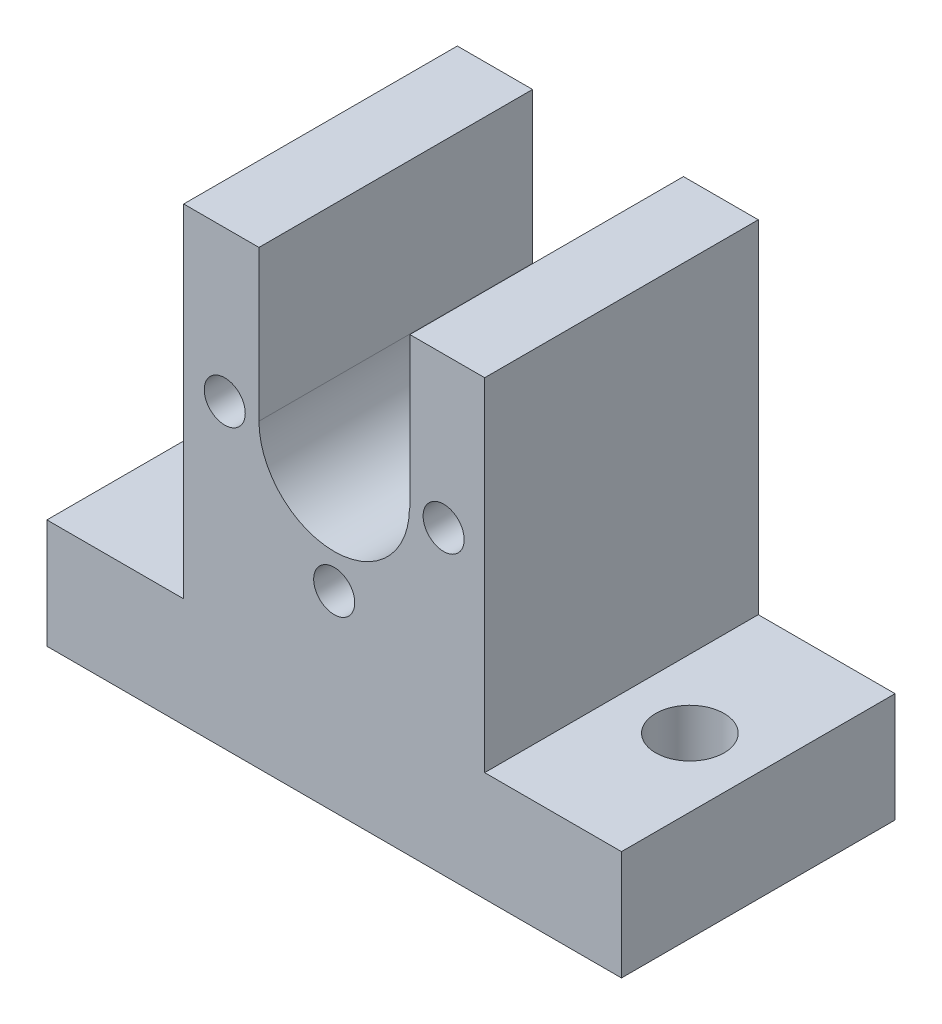
ISO-10303-21;
HEADER;
FILE_DESCRIPTION(('STEP AP214'),'2;1');
FILE_NAME('part.step','',(''),(''),'','','');
FILE_SCHEMA(('AUTOMOTIVE_DESIGN { 1 0 10303 214 1 1 1 1 }'));
ENDSEC;
DATA;
#1=APPLICATION_CONTEXT('core data for automotive mechanical design processes');
#2=APPLICATION_PROTOCOL_DEFINITION('international standard','automotive_design',2000,#1);
#3=PRODUCT_CONTEXT('',#1,'mechanical');
#4=PRODUCT('Part','Part','',(#3));
#5=PRODUCT_RELATED_PRODUCT_CATEGORY('part','',(#4));
#6=PRODUCT_DEFINITION_FORMATION('','',#4);
#7=PRODUCT_DEFINITION_CONTEXT('part definition',#1,'design');
#8=PRODUCT_DEFINITION('design','',#6,#7);
#9=PRODUCT_DEFINITION_SHAPE('','',#8);
#10=(LENGTH_UNIT() NAMED_UNIT(*) SI_UNIT(.MILLI.,.METRE.));
#11=(NAMED_UNIT(*) PLANE_ANGLE_UNIT() SI_UNIT($,.RADIAN.));
#12=(NAMED_UNIT(*) SI_UNIT($,.STERADIAN.) SOLID_ANGLE_UNIT());
#13=UNCERTAINTY_MEASURE_WITH_UNIT(LENGTH_MEASURE(1.E-05),#10,'distance_accuracy_value','');
#14=(GEOMETRIC_REPRESENTATION_CONTEXT(3) GLOBAL_UNCERTAINTY_ASSIGNED_CONTEXT((#13)) GLOBAL_UNIT_ASSIGNED_CONTEXT((#10,
#11,#12)) REPRESENTATION_CONTEXT('',''));
#15=CARTESIAN_POINT('',(0.,0.,0.));
#16=DIRECTION('',(0.,0.,1.));
#17=DIRECTION('',(1.,0.,0.));
#18=AXIS2_PLACEMENT_3D('',#15,#16,#17);
#19=CARTESIAN_POINT('',(0.673469387755095,4.1156462585034,20.));
#20=DIRECTION('',(0.,0.,-1.));
#21=DIRECTION('',(-1.,0.,0.));
#22=AXIS2_PLACEMENT_3D('',#19,#20,#21);
#23=CYLINDRICAL_SURFACE('',#22,5.5);
#24=CARTESIAN_POINT('',(0.673469387755095,4.1156462585034,0.));
#25=DIRECTION('',(0.,0.,1.));
#26=DIRECTION('',(1.,0.,0.));
#27=AXIS2_PLACEMENT_3D('',#24,#25,#26);
#28=CIRCLE('',#27,5.5);
#29=CARTESIAN_POINT('',(-4.8265306122449,4.1156462585034,0.));
#30=VERTEX_POINT('',#29);
#31=CARTESIAN_POINT('',(6.17346938775509,4.1156462585034,0.));
#32=VERTEX_POINT('',#31);
#33=EDGE_CURVE('E169',#30,#32,#28,.T.);
#34=ORIENTED_EDGE('',*,*,#33,.F.);
#35=DIRECTION('',(0.,0.,-1.));
#36=VECTOR('',#35,1.);
#37=CARTESIAN_POINT('',(-4.8265306122449,4.1156462585034,20.));
#38=LINE('',#37,#36);
#39=CARTESIAN_POINT('',(-4.8265306122449,4.1156462585034,20.));
#40=VERTEX_POINT('',#39);
#41=EDGE_CURVE('E11',#40,#30,#38,.T.);
#42=ORIENTED_EDGE('',*,*,#41,.F.);
#43=CARTESIAN_POINT('',(0.673469387755095,4.1156462585034,20.));
#44=DIRECTION('',(0.,0.,1.));
#45=DIRECTION('',(1.,0.,0.));
#46=AXIS2_PLACEMENT_3D('',#43,#44,#45);
#47=CIRCLE('',#46,5.5);
#48=CARTESIAN_POINT('',(6.17346938775509,4.1156462585034,20.));
#49=VERTEX_POINT('',#48);
#50=EDGE_CURVE('E254',#40,#49,#47,.T.);
#51=ORIENTED_EDGE('',*,*,#50,.T.);
#52=DIRECTION('',(0.,0.,-1.));
#53=VECTOR('',#52,1.);
#54=CARTESIAN_POINT('',(6.17346938775509,4.1156462585034,20.));
#55=LINE('',#54,#53);
#56=EDGE_CURVE('E51',#49,#32,#55,.T.);
#57=ORIENTED_EDGE('',*,*,#56,.T.);
#58=EDGE_LOOP('',(#34,#42,#51,#57));
#59=FACE_BOUND('',#58,.T.);
#60=ADVANCED_FACE('F33',(#59),#23,.F.);
#61=CARTESIAN_POINT('',(-4.8265306122449,0.,20.));
#62=DIRECTION('',(-1.,0.,0.));
#63=DIRECTION('',(0.,0.,1.));
#64=AXIS2_PLACEMENT_3D('',#61,#62,#63);
#65=PLANE('',#64);
#66=DIRECTION('',(0.,1.,0.));
#67=VECTOR('',#66,1.);
#68=CARTESIAN_POINT('',(-4.8265306122449,0.,0.));
#69=LINE('',#68,#67);
#70=CARTESIAN_POINT('',(-4.8265306122449,15.1156462585034,0.));
#71=VERTEX_POINT('',#70);
#72=EDGE_CURVE('E171',#30,#71,#69,.T.);
#73=ORIENTED_EDGE('',*,*,#72,.T.);
#74=DIRECTION('',(0.,0.,-1.));
#75=VECTOR('',#74,1.);
#76=CARTESIAN_POINT('',(-4.8265306122449,15.1156462585034,20.));
#77=LINE('',#76,#75);
#78=CARTESIAN_POINT('',(-4.8265306122449,15.1156462585034,20.));
#79=VERTEX_POINT('',#78);
#80=EDGE_CURVE('E43',#79,#71,#77,.T.);
#81=ORIENTED_EDGE('',*,*,#80,.F.);
#82=DIRECTION('',(0.,1.,0.));
#83=VECTOR('',#82,1.);
#84=CARTESIAN_POINT('',(-4.8265306122449,0.,20.));
#85=LINE('',#84,#83);
#86=EDGE_CURVE('E252',#40,#79,#85,.T.);
#87=ORIENTED_EDGE('',*,*,#86,.F.);
#88=ORIENTED_EDGE('',*,*,#41,.T.);
#89=EDGE_LOOP('',(#73,#81,#87,#88));
#90=FACE_BOUND('',#89,.T.);
#91=ADVANCED_FACE('F239',(#90),#65,.F.);
#92=CARTESIAN_POINT('',(0.,15.1156462585034,20.));
#93=DIRECTION('',(0.,1.,0.));
#94=DIRECTION('',(0.,0.,1.));
#95=AXIS2_PLACEMENT_3D('',#92,#93,#94);
#96=PLANE('',#95);
#97=DIRECTION('',(1.,0.,0.));
#98=VECTOR('',#97,1.);
#99=CARTESIAN_POINT('',(0.,15.1156462585034,0.));
#100=LINE('',#99,#98);
#101=CARTESIAN_POINT('',(-10.3265306122449,15.1156462585034,0.));
#102=VERTEX_POINT('',#101);
#103=EDGE_CURVE('E174',#102,#71,#100,.T.);
#104=ORIENTED_EDGE('',*,*,#103,.F.);
#105=DIRECTION('',(0.,0.,-1.));
#106=VECTOR('',#105,1.);
#107=CARTESIAN_POINT('',(-10.3265306122449,15.1156462585034,20.));
#108=LINE('',#107,#106);
#109=CARTESIAN_POINT('',(-10.3265306122449,15.1156462585034,20.));
#110=VERTEX_POINT('',#109);
#111=EDGE_CURVE('E228',#110,#102,#108,.T.);
#112=ORIENTED_EDGE('',*,*,#111,.F.);
#113=DIRECTION('',(1.,0.,0.));
#114=VECTOR('',#113,1.);
#115=CARTESIAN_POINT('',(0.,15.1156462585034,20.));
#116=LINE('',#115,#114);
#117=EDGE_CURVE('E236',#110,#79,#116,.T.);
#118=ORIENTED_EDGE('',*,*,#117,.T.);
#119=ORIENTED_EDGE('',*,*,#80,.T.);
#120=EDGE_LOOP('',(#104,#112,#118,#119));
#121=FACE_BOUND('',#120,.T.);
#122=ADVANCED_FACE('F234',(#121),#96,.T.);
#123=CARTESIAN_POINT('',(-10.3265306122449,0.,20.));
#124=DIRECTION('',(1.,0.,0.));
#125=DIRECTION('',(0.,1.,0.));
#126=AXIS2_PLACEMENT_3D('',#123,#124,#125);
#127=PLANE('',#126);
#128=DIRECTION('',(0.,-1.,0.));
#129=VECTOR('',#128,1.);
#130=CARTESIAN_POINT('',(-10.3265306122449,0.,0.));
#131=LINE('',#130,#129);
#132=CARTESIAN_POINT('',(-10.3265306122449,-9.8843537414966,0.));
#133=VERTEX_POINT('',#132);
#134=EDGE_CURVE('E177',#102,#133,#131,.T.);
#135=ORIENTED_EDGE('',*,*,#134,.T.);
#136=DIRECTION('',(0.,0.,-1.));
#137=VECTOR('',#136,1.);
#138=CARTESIAN_POINT('',(-10.3265306122449,-9.8843537414966,20.));
#139=LINE('',#138,#137);
#140=CARTESIAN_POINT('',(-10.3265306122449,-9.8843537414966,20.));
#141=VERTEX_POINT('',#140);
#142=EDGE_CURVE('E225',#141,#133,#139,.T.);
#143=ORIENTED_EDGE('',*,*,#142,.F.);
#144=DIRECTION('',(0.,-1.,0.));
#145=VECTOR('',#144,1.);
#146=CARTESIAN_POINT('',(-10.3265306122449,0.,20.));
#147=LINE('',#146,#145);
#148=EDGE_CURVE('E249',#110,#141,#147,.T.);
#149=ORIENTED_EDGE('',*,*,#148,.F.);
#150=ORIENTED_EDGE('',*,*,#111,.T.);
#151=EDGE_LOOP('',(#135,#143,#149,#150));
#152=FACE_BOUND('',#151,.T.);
#153=ADVANCED_FACE('F246',(#152),#127,.F.);
#154=CARTESIAN_POINT('',(0.,-9.8843537414966,20.));
#155=DIRECTION('',(0.,-1.,0.));
#156=DIRECTION('',(0.,0.,-1.));
#157=AXIS2_PLACEMENT_3D('',#154,#155,#156);
#158=PLANE('',#157);
#159=CARTESIAN_POINT('',(-15.3265306122449,-9.8843537414966,10.));
#160=DIRECTION('',(0.,1.,0.));
#161=DIRECTION('',(0.,0.,1.));
#162=AXIS2_PLACEMENT_3D('',#159,#160,#161);
#163=CIRCLE('',#162,2.5);
#164=CARTESIAN_POINT('',(-15.3265306122449,-9.8843537414966,12.5));
#165=VERTEX_POINT('',#164);
#166=EDGE_CURVE('E419',#165,#165,#163,.T.);
#167=ORIENTED_EDGE('',*,*,#166,.F.);
#168=EDGE_LOOP('',(#167));
#169=FACE_BOUND('',#168,.T.);
#170=DIRECTION('',(-1.,0.,0.));
#171=VECTOR('',#170,1.);
#172=CARTESIAN_POINT('',(0.,-9.8843537414966,0.));
#173=LINE('',#172,#171);
#174=CARTESIAN_POINT('',(-20.3265306122449,-9.8843537414966,0.));
#175=VERTEX_POINT('',#174);
#176=EDGE_CURVE('E180',#133,#175,#173,.T.);
#177=ORIENTED_EDGE('',*,*,#176,.T.);
#178=DIRECTION('',(0.,0.,-1.));
#179=VECTOR('',#178,1.);
#180=CARTESIAN_POINT('',(-20.3265306122449,-9.8843537414966,20.));
#181=LINE('',#180,#179);
#182=CARTESIAN_POINT('',(-20.3265306122449,-9.8843537414966,20.));
#183=VERTEX_POINT('',#182);
#184=EDGE_CURVE('E223',#183,#175,#181,.T.);
#185=ORIENTED_EDGE('',*,*,#184,.F.);
#186=DIRECTION('',(-1.,0.,0.));
#187=VECTOR('',#186,1.);
#188=CARTESIAN_POINT('',(0.,-9.8843537414966,20.));
#189=LINE('',#188,#187);
#190=EDGE_CURVE('E250',#141,#183,#189,.T.);
#191=ORIENTED_EDGE('',*,*,#190,.F.);
#192=ORIENTED_EDGE('',*,*,#142,.T.);
#193=EDGE_LOOP('',(#177,#185,#191,#192));
#194=FACE_BOUND('',#193,.T.);
#195=ADVANCED_FACE('F296',(#169,#194),#158,.F.);
#196=CARTESIAN_POINT('',(-20.3265306122449,0.,20.));
#197=DIRECTION('',(-1.,0.,0.));
#198=DIRECTION('',(0.,0.,1.));
#199=AXIS2_PLACEMENT_3D('',#196,#197,#198);
#200=PLANE('',#199);
#201=DIRECTION('',(0.,1.,0.));
#202=VECTOR('',#201,1.);
#203=CARTESIAN_POINT('',(-20.3265306122449,0.,0.));
#204=LINE('',#203,#202);
#205=CARTESIAN_POINT('',(-20.3265306122449,-17.8843537414966,0.));
#206=VERTEX_POINT('',#205);
#207=EDGE_CURVE('E183',#206,#175,#204,.T.);
#208=ORIENTED_EDGE('',*,*,#207,.F.);
#209=DIRECTION('',(0.,0.,-1.));
#210=VECTOR('',#209,1.);
#211=CARTESIAN_POINT('',(-20.3265306122449,-17.8843537414966,20.));
#212=LINE('',#211,#210);
#213=CARTESIAN_POINT('',(-20.3265306122449,-17.8843537414966,20.));
#214=VERTEX_POINT('',#213);
#215=EDGE_CURVE('E221',#214,#206,#212,.T.);
#216=ORIENTED_EDGE('',*,*,#215,.F.);
#217=DIRECTION('',(0.,1.,0.));
#218=VECTOR('',#217,1.);
#219=CARTESIAN_POINT('',(-20.3265306122449,0.,20.));
#220=LINE('',#219,#218);
#221=EDGE_CURVE('E259',#214,#183,#220,.T.);
#222=ORIENTED_EDGE('',*,*,#221,.T.);
#223=ORIENTED_EDGE('',*,*,#184,.T.);
#224=EDGE_LOOP('',(#208,#216,#222,#223));
#225=FACE_BOUND('',#224,.T.);
#226=ADVANCED_FACE('F299',(#225),#200,.T.);
#227=CARTESIAN_POINT('',(0.,-17.8843537414966,20.));
#228=DIRECTION('',(0.,1.,0.));
#229=DIRECTION('',(0.,0.,1.));
#230=AXIS2_PLACEMENT_3D('',#227,#228,#229);
#231=PLANE('',#230);
#232=CARTESIAN_POINT('',(16.6734693877551,-17.8843537414966,10.));
#233=DIRECTION('',(0.,1.,0.));
#234=DIRECTION('',(0.,0.,1.));
#235=AXIS2_PLACEMENT_3D('',#232,#233,#234);
#236=CIRCLE('',#235,2.5);
#237=CARTESIAN_POINT('',(16.6734693877551,-17.8843537414966,12.5));
#238=VERTEX_POINT('',#237);
#239=EDGE_CURVE('E423',#238,#238,#236,.T.);
#240=ORIENTED_EDGE('',*,*,#239,.T.);
#241=EDGE_LOOP('',(#240));
#242=FACE_BOUND('',#241,.T.);
#243=CARTESIAN_POINT('',(-15.3265306122449,-17.8843537414966,10.));
#244=DIRECTION('',(0.,1.,0.));
#245=DIRECTION('',(0.,0.,1.));
#246=AXIS2_PLACEMENT_3D('',#243,#244,#245);
#247=CIRCLE('',#246,2.5);
#248=CARTESIAN_POINT('',(-15.3265306122449,-17.8843537414966,12.5));
#249=VERTEX_POINT('',#248);
#250=EDGE_CURVE('E37',#249,#249,#247,.T.);
#251=ORIENTED_EDGE('',*,*,#250,.T.);
#252=EDGE_LOOP('',(#251));
#253=FACE_BOUND('',#252,.T.);
#254=DIRECTION('',(1.,0.,0.));
#255=VECTOR('',#254,1.);
#256=CARTESIAN_POINT('',(0.,-17.8843537414966,0.));
#257=LINE('',#256,#255);
#258=CARTESIAN_POINT('',(21.6734693877551,-17.8843537414966,0.));
#259=VERTEX_POINT('',#258);
#260=EDGE_CURVE('E186',#206,#259,#257,.T.);
#261=ORIENTED_EDGE('',*,*,#260,.T.);
#262=DIRECTION('',(0.,0.,-1.));
#263=VECTOR('',#262,1.);
#264=CARTESIAN_POINT('',(21.6734693877551,-17.8843537414966,20.));
#265=LINE('',#264,#263);
#266=CARTESIAN_POINT('',(21.6734693877551,-17.8843537414966,20.));
#267=VERTEX_POINT('',#266);
#268=EDGE_CURVE('E218',#267,#259,#265,.T.);
#269=ORIENTED_EDGE('',*,*,#268,.F.);
#270=DIRECTION('',(1.,0.,0.));
#271=VECTOR('',#270,1.);
#272=CARTESIAN_POINT('',(0.,-17.8843537414966,20.));
#273=LINE('',#272,#271);
#274=EDGE_CURVE('E262',#214,#267,#273,.T.);
#275=ORIENTED_EDGE('',*,*,#274,.F.);
#276=ORIENTED_EDGE('',*,*,#215,.T.);
#277=EDGE_LOOP('',(#261,#269,#275,#276));
#278=FACE_BOUND('',#277,.T.);
#279=ADVANCED_FACE('F303',(#242,#253,#278),#231,.F.);
#280=CARTESIAN_POINT('',(21.6734693877551,0.,20.));
#281=DIRECTION('',(-1.,0.,0.));
#282=DIRECTION('',(0.,0.,1.));
#283=AXIS2_PLACEMENT_3D('',#280,#281,#282);
#284=PLANE('',#283);
#285=DIRECTION('',(0.,1.,0.));
#286=VECTOR('',#285,1.);
#287=CARTESIAN_POINT('',(21.6734693877551,0.,0.));
#288=LINE('',#287,#286);
#289=CARTESIAN_POINT('',(21.6734693877551,-9.8843537414966,0.));
#290=VERTEX_POINT('',#289);
#291=EDGE_CURVE('E189',#259,#290,#288,.T.);
#292=ORIENTED_EDGE('',*,*,#291,.T.);
#293=DIRECTION('',(0.,0.,-1.));
#294=VECTOR('',#293,1.);
#295=CARTESIAN_POINT('',(21.6734693877551,-9.8843537414966,20.));
#296=LINE('',#295,#294);
#297=CARTESIAN_POINT('',(21.6734693877551,-9.8843537414966,20.));
#298=VERTEX_POINT('',#297);
#299=EDGE_CURVE('E216',#298,#290,#296,.T.);
#300=ORIENTED_EDGE('',*,*,#299,.F.);
#301=DIRECTION('',(0.,1.,0.));
#302=VECTOR('',#301,1.);
#303=CARTESIAN_POINT('',(21.6734693877551,0.,20.));
#304=LINE('',#303,#302);
#305=EDGE_CURVE('E265',#267,#298,#304,.T.);
#306=ORIENTED_EDGE('',*,*,#305,.F.);
#307=ORIENTED_EDGE('',*,*,#268,.T.);
#308=EDGE_LOOP('',(#292,#300,#306,#307));
#309=FACE_BOUND('',#308,.T.);
#310=ADVANCED_FACE('F307',(#309),#284,.F.);
#311=CARTESIAN_POINT('',(0.,-9.8843537414966,20.));
#312=DIRECTION('',(0.,1.,0.));
#313=DIRECTION('',(0.,0.,1.));
#314=AXIS2_PLACEMENT_3D('',#311,#312,#313);
#315=PLANE('',#314);
#316=CARTESIAN_POINT('',(16.6734693877551,-9.8843537414966,10.));
#317=DIRECTION('',(0.,1.,0.));
#318=DIRECTION('',(0.,0.,1.));
#319=AXIS2_PLACEMENT_3D('',#316,#317,#318);
#320=CIRCLE('',#319,2.5);
#321=CARTESIAN_POINT('',(16.6734693877551,-9.8843537414966,12.5));
#322=VERTEX_POINT('',#321);
#323=EDGE_CURVE('E425',#322,#322,#320,.T.);
#324=ORIENTED_EDGE('',*,*,#323,.F.);
#325=EDGE_LOOP('',(#324));
#326=FACE_BOUND('',#325,.T.);
#327=DIRECTION('',(1.,0.,0.));
#328=VECTOR('',#327,1.);
#329=CARTESIAN_POINT('',(0.,-9.8843537414966,0.));
#330=LINE('',#329,#328);
#331=CARTESIAN_POINT('',(11.6734693877551,-9.8843537414966,0.));
#332=VERTEX_POINT('',#331);
#333=EDGE_CURVE('E192',#332,#290,#330,.T.);
#334=ORIENTED_EDGE('',*,*,#333,.F.);
#335=DIRECTION('',(0.,0.,-1.));
#336=VECTOR('',#335,1.);
#337=CARTESIAN_POINT('',(11.6734693877551,-9.8843537414966,20.));
#338=LINE('',#337,#336);
#339=CARTESIAN_POINT('',(11.6734693877551,-9.8843537414966,20.));
#340=VERTEX_POINT('',#339);
#341=EDGE_CURVE('E214',#340,#332,#338,.T.);
#342=ORIENTED_EDGE('',*,*,#341,.F.);
#343=DIRECTION('',(1.,0.,0.));
#344=VECTOR('',#343,1.);
#345=CARTESIAN_POINT('',(0.,-9.8843537414966,20.));
#346=LINE('',#345,#344);
#347=EDGE_CURVE('E267',#340,#298,#346,.T.);
#348=ORIENTED_EDGE('',*,*,#347,.T.);
#349=ORIENTED_EDGE('',*,*,#299,.T.);
#350=EDGE_LOOP('',(#334,#342,#348,#349));
#351=FACE_BOUND('',#350,.T.);
#352=ADVANCED_FACE('F311',(#326,#351),#315,.T.);
#353=CARTESIAN_POINT('',(11.6734693877551,0.,20.));
#354=DIRECTION('',(1.,0.,0.));
#355=DIRECTION('',(0.,1.,0.));
#356=AXIS2_PLACEMENT_3D('',#353,#354,#355);
#357=PLANE('',#356);
#358=DIRECTION('',(0.,-1.,0.));
#359=VECTOR('',#358,1.);
#360=CARTESIAN_POINT('',(11.6734693877551,0.,0.));
#361=LINE('',#360,#359);
#362=CARTESIAN_POINT('',(11.6734693877551,15.1156462585034,0.));
#363=VERTEX_POINT('',#362);
#364=EDGE_CURVE('E195',#363,#332,#361,.T.);
#365=ORIENTED_EDGE('',*,*,#364,.F.);
#366=DIRECTION('',(0.,0.,-1.));
#367=VECTOR('',#366,1.);
#368=CARTESIAN_POINT('',(11.6734693877551,15.1156462585034,20.));
#369=LINE('',#368,#367);
#370=CARTESIAN_POINT('',(11.6734693877551,15.1156462585034,20.));
#371=VERTEX_POINT('',#370);
#372=EDGE_CURVE('E140',#371,#363,#369,.T.);
#373=ORIENTED_EDGE('',*,*,#372,.F.);
#374=DIRECTION('',(0.,-1.,0.));
#375=VECTOR('',#374,1.);
#376=CARTESIAN_POINT('',(11.6734693877551,0.,20.));
#377=LINE('',#376,#375);
#378=EDGE_CURVE('E152',#371,#340,#377,.T.);
#379=ORIENTED_EDGE('',*,*,#378,.T.);
#380=ORIENTED_EDGE('',*,*,#341,.T.);
#381=EDGE_LOOP('',(#365,#373,#379,#380));
#382=FACE_BOUND('',#381,.T.);
#383=ADVANCED_FACE('F271',(#382),#357,.T.);
#384=CARTESIAN_POINT('',(0.,15.1156462585034,20.));
#385=DIRECTION('',(0.,1.,0.));
#386=DIRECTION('',(0.,0.,1.));
#387=AXIS2_PLACEMENT_3D('',#384,#385,#386);
#388=PLANE('',#387);
#389=DIRECTION('',(1.,0.,0.));
#390=VECTOR('',#389,1.);
#391=CARTESIAN_POINT('',(0.,15.1156462585034,0.));
#392=LINE('',#391,#390);
#393=CARTESIAN_POINT('',(6.20500629325501,15.1156462585034,0.));
#394=VERTEX_POINT('',#393);
#395=EDGE_CURVE('E136',#394,#363,#392,.T.);
#396=ORIENTED_EDGE('',*,*,#395,.F.);
#397=DIRECTION('',(0.,0.,-1.));
#398=VECTOR('',#397,1.);
#399=CARTESIAN_POINT('',(6.20500629325501,15.1156462585034,20.));
#400=LINE('',#399,#398);
#401=CARTESIAN_POINT('',(6.20500629325501,15.1156462585034,20.));
#402=VERTEX_POINT('',#401);
#403=EDGE_CURVE('E131',#402,#394,#400,.T.);
#404=ORIENTED_EDGE('',*,*,#403,.F.);
#405=DIRECTION('',(1.,0.,0.));
#406=VECTOR('',#405,1.);
#407=CARTESIAN_POINT('',(0.,15.1156462585034,20.));
#408=LINE('',#407,#406);
#409=EDGE_CURVE('E134',#402,#371,#408,.T.);
#410=ORIENTED_EDGE('',*,*,#409,.T.);
#411=ORIENTED_EDGE('',*,*,#372,.T.);
#412=EDGE_LOOP('',(#396,#404,#410,#411));
#413=FACE_BOUND('',#412,.T.);
#414=ADVANCED_FACE('F133',(#413),#388,.T.);
#415=CARTESIAN_POINT('',(6.20500629325501,0.,20.));
#416=DIRECTION('',(-1.,0.,0.));
#417=DIRECTION('',(0.,0.,1.));
#418=AXIS2_PLACEMENT_3D('',#415,#416,#417);
#419=PLANE('',#418);
#420=DIRECTION('',(0.,1.,0.));
#421=VECTOR('',#420,1.);
#422=CARTESIAN_POINT('',(6.20500629325501,0.,0.));
#423=LINE('',#422,#421);
#424=CARTESIAN_POINT('',(6.20500629325501,4.1156462585034,0.));
#425=VERTEX_POINT('',#424);
#426=EDGE_CURVE('E199',#425,#394,#423,.T.);
#427=ORIENTED_EDGE('',*,*,#426,.F.);
#428=DIRECTION('',(0.,0.,-1.));
#429=VECTOR('',#428,1.);
#430=CARTESIAN_POINT('',(6.20500629325501,4.1156462585034,20.));
#431=LINE('',#430,#429);
#432=CARTESIAN_POINT('',(6.20500629325501,4.1156462585034,20.));
#433=VERTEX_POINT('',#432);
#434=EDGE_CURVE('E91',#433,#425,#431,.T.);
#435=ORIENTED_EDGE('',*,*,#434,.F.);
#436=DIRECTION('',(0.,1.,0.));
#437=VECTOR('',#436,1.);
#438=CARTESIAN_POINT('',(6.20500629325501,0.,20.));
#439=LINE('',#438,#437);
#440=EDGE_CURVE('E149',#433,#402,#439,.T.);
#441=ORIENTED_EDGE('',*,*,#440,.T.);
#442=ORIENTED_EDGE('',*,*,#403,.T.);
#443=EDGE_LOOP('',(#427,#435,#441,#442));
#444=FACE_BOUND('',#443,.T.);
#445=ADVANCED_FACE('F154',(#444),#419,.T.);
#446=CARTESIAN_POINT('',(-7.3265306122449,4.1156462585034,20.));
#447=DIRECTION('',(0.,0.,-1.));
#448=DIRECTION('',(-1.,0.,0.));
#449=AXIS2_PLACEMENT_3D('',#446,#447,#448);
#450=CYLINDRICAL_SURFACE('',#449,1.5);
#451=CARTESIAN_POINT('',(-7.3265306122449,4.1156462585034,20.));
#452=DIRECTION('',(0.,0.,1.));
#453=DIRECTION('',(1.,0.,0.));
#454=AXIS2_PLACEMENT_3D('',#451,#452,#453);
#455=CIRCLE('',#454,1.5);
#456=CARTESIAN_POINT('',(-5.8265306122449,4.1156462585034,20.));
#457=VERTEX_POINT('',#456);
#458=EDGE_CURVE('E157',#457,#457,#455,.T.);
#459=ORIENTED_EDGE('',*,*,#458,.T.);
#460=EDGE_LOOP('',(#459));
#461=FACE_BOUND('',#460,.T.);
#462=CARTESIAN_POINT('',(-7.3265306122449,4.1156462585034,0.));
#463=DIRECTION('',(0.,0.,1.));
#464=DIRECTION('',(1.,0.,0.));
#465=AXIS2_PLACEMENT_3D('',#462,#463,#464);
#466=CIRCLE('',#465,1.5);
#467=CARTESIAN_POINT('',(-5.8265306122449,4.1156462585034,0.));
#468=VERTEX_POINT('',#467);
#469=EDGE_CURVE('E204',#468,#468,#466,.T.);
#470=ORIENTED_EDGE('',*,*,#469,.F.);
#471=EDGE_LOOP('',(#470));
#472=FACE_BOUND('',#471,.T.);
#473=ADVANCED_FACE('F275',(#461,#472),#450,.F.);
#474=CARTESIAN_POINT('',(0.,4.1156462585034,20.));
#475=DIRECTION('',(0.,1.,0.));
#476=DIRECTION('',(-1.,0.,0.));
#477=AXIS2_PLACEMENT_3D('',#474,#475,#476);
#478=PLANE('',#477);
#479=DIRECTION('',(1.,0.,0.));
#480=VECTOR('',#479,1.);
#481=CARTESIAN_POINT('',(0.,4.1156462585034,0.));
#482=LINE('',#481,#480);
#483=EDGE_CURVE('E201',#32,#425,#482,.T.);
#484=ORIENTED_EDGE('',*,*,#483,.F.);
#485=ORIENTED_EDGE('',*,*,#56,.F.);
#486=DIRECTION('',(1.,0.,0.));
#487=VECTOR('',#486,1.);
#488=CARTESIAN_POINT('',(0.,4.1156462585034,20.));
#489=LINE('',#488,#487);
#490=EDGE_CURVE('E155',#49,#433,#489,.T.);
#491=ORIENTED_EDGE('',*,*,#490,.T.);
#492=ORIENTED_EDGE('',*,*,#434,.T.);
#493=EDGE_LOOP('',(#484,#485,#491,#492));
#494=FACE_BOUND('',#493,.T.);
#495=ADVANCED_FACE('F273',(#494),#478,.T.);
#496=CARTESIAN_POINT('',(0.673469387755095,-3.8843537414966,20.));
#497=DIRECTION('',(0.,0.,-1.));
#498=DIRECTION('',(-1.,0.,0.));
#499=AXIS2_PLACEMENT_3D('',#496,#497,#498);
#500=CYLINDRICAL_SURFACE('',#499,1.5);
#501=CARTESIAN_POINT('',(0.673469387755095,-3.8843537414966,20.));
#502=DIRECTION('',(0.,0.,1.));
#503=DIRECTION('',(1.,0.,0.));
#504=AXIS2_PLACEMENT_3D('',#501,#502,#503);
#505=CIRCLE('',#504,1.5);
#506=CARTESIAN_POINT('',(2.1734693877551,-3.8843537414966,20.));
#507=VERTEX_POINT('',#506);
#508=EDGE_CURVE('E210',#507,#507,#505,.T.);
#509=ORIENTED_EDGE('',*,*,#508,.T.);
#510=EDGE_LOOP('',(#509));
#511=FACE_BOUND('',#510,.T.);
#512=CARTESIAN_POINT('',(0.673469387755095,-3.8843537414966,0.));
#513=DIRECTION('',(0.,0.,1.));
#514=DIRECTION('',(1.,0.,0.));
#515=AXIS2_PLACEMENT_3D('',#512,#513,#514);
#516=CIRCLE('',#515,1.5);
#517=CARTESIAN_POINT('',(2.1734693877551,-3.8843537414966,0.));
#518=VERTEX_POINT('',#517);
#519=EDGE_CURVE('E166',#518,#518,#516,.T.);
#520=ORIENTED_EDGE('',*,*,#519,.F.);
#521=EDGE_LOOP('',(#520));
#522=FACE_BOUND('',#521,.T.);
#523=ADVANCED_FACE('F35',(#511,#522),#500,.F.);
#524=CARTESIAN_POINT('',(8.6734693877551,4.1156462585034,20.));
#525=DIRECTION('',(0.,0.,-1.));
#526=DIRECTION('',(-1.,0.,0.));
#527=AXIS2_PLACEMENT_3D('',#524,#525,#526);
#528=CYLINDRICAL_SURFACE('',#527,1.5);
#529=CARTESIAN_POINT('',(8.6734693877551,4.1156462585034,20.));
#530=DIRECTION('',(0.,0.,1.));
#531=DIRECTION('',(1.,0.,0.));
#532=AXIS2_PLACEMENT_3D('',#529,#530,#531);
#533=CIRCLE('',#532,1.5);
#534=CARTESIAN_POINT('',(10.1734693877551,4.1156462585034,20.));
#535=VERTEX_POINT('',#534);
#536=EDGE_CURVE('E163',#535,#535,#533,.T.);
#537=ORIENTED_EDGE('',*,*,#536,.T.);
#538=EDGE_LOOP('',(#537));
#539=FACE_BOUND('',#538,.T.);
#540=CARTESIAN_POINT('',(8.6734693877551,4.1156462585034,0.));
#541=DIRECTION('',(0.,0.,1.));
#542=DIRECTION('',(1.,0.,0.));
#543=AXIS2_PLACEMENT_3D('',#540,#541,#542);
#544=CIRCLE('',#543,1.5);
#545=CARTESIAN_POINT('',(10.1734693877551,4.1156462585034,0.));
#546=VERTEX_POINT('',#545);
#547=EDGE_CURVE('E207',#546,#546,#544,.T.);
#548=ORIENTED_EDGE('',*,*,#547,.F.);
#549=EDGE_LOOP('',(#548));
#550=FACE_BOUND('',#549,.T.);
#551=ADVANCED_FACE('F281',(#539,#550),#528,.F.);
#552=CARTESIAN_POINT('',(0.,0.,20.));
#553=DIRECTION('',(0.,0.,1.));
#554=DIRECTION('',(1.,0.,0.));
#555=AXIS2_PLACEMENT_3D('',#552,#553,#554);
#556=PLANE('',#555);
#557=ORIENTED_EDGE('',*,*,#508,.F.);
#558=EDGE_LOOP('',(#557));
#559=FACE_BOUND('',#558,.T.);
#560=ORIENTED_EDGE('',*,*,#50,.F.);
#561=ORIENTED_EDGE('',*,*,#86,.T.);
#562=ORIENTED_EDGE('',*,*,#117,.F.);
#563=ORIENTED_EDGE('',*,*,#148,.T.);
#564=ORIENTED_EDGE('',*,*,#190,.T.);
#565=ORIENTED_EDGE('',*,*,#221,.F.);
#566=ORIENTED_EDGE('',*,*,#274,.T.);
#567=ORIENTED_EDGE('',*,*,#305,.T.);
#568=ORIENTED_EDGE('',*,*,#347,.F.);
#569=ORIENTED_EDGE('',*,*,#378,.F.);
#570=ORIENTED_EDGE('',*,*,#409,.F.);
#571=ORIENTED_EDGE('',*,*,#440,.F.);
#572=ORIENTED_EDGE('',*,*,#490,.F.);
#573=EDGE_LOOP('',(#560,#561,#562,#563,#564,#565,#566,#567,#568,#569,#570,#571,#572));
#574=FACE_BOUND('',#573,.T.);
#575=ORIENTED_EDGE('',*,*,#458,.F.);
#576=EDGE_LOOP('',(#575));
#577=FACE_BOUND('',#576,.T.);
#578=ORIENTED_EDGE('',*,*,#536,.F.);
#579=EDGE_LOOP('',(#578));
#580=FACE_BOUND('',#579,.T.);
#581=ADVANCED_FACE('F146',(#559,#574,#577,#580),#556,.T.);
#582=CARTESIAN_POINT('',(0.,0.,0.));
#583=DIRECTION('',(0.,0.,1.));
#584=DIRECTION('',(1.,0.,0.));
#585=AXIS2_PLACEMENT_3D('',#582,#583,#584);
#586=PLANE('',#585);
#587=ORIENTED_EDGE('',*,*,#519,.T.);
#588=EDGE_LOOP('',(#587));
#589=FACE_BOUND('',#588,.T.);
#590=ORIENTED_EDGE('',*,*,#33,.T.);
#591=ORIENTED_EDGE('',*,*,#483,.T.);
#592=ORIENTED_EDGE('',*,*,#426,.T.);
#593=ORIENTED_EDGE('',*,*,#395,.T.);
#594=ORIENTED_EDGE('',*,*,#364,.T.);
#595=ORIENTED_EDGE('',*,*,#333,.T.);
#596=ORIENTED_EDGE('',*,*,#291,.F.);
#597=ORIENTED_EDGE('',*,*,#260,.F.);
#598=ORIENTED_EDGE('',*,*,#207,.T.);
#599=ORIENTED_EDGE('',*,*,#176,.F.);
#600=ORIENTED_EDGE('',*,*,#134,.F.);
#601=ORIENTED_EDGE('',*,*,#103,.T.);
#602=ORIENTED_EDGE('',*,*,#72,.F.);
#603=EDGE_LOOP('',(#590,#591,#592,#593,#594,#595,#596,#597,#598,#599,#600,#601,#602));
#604=FACE_BOUND('',#603,.T.);
#605=ORIENTED_EDGE('',*,*,#469,.T.);
#606=EDGE_LOOP('',(#605));
#607=FACE_BOUND('',#606,.T.);
#608=ORIENTED_EDGE('',*,*,#547,.T.);
#609=EDGE_LOOP('',(#608));
#610=FACE_BOUND('',#609,.T.);
#611=ADVANCED_FACE('F242',(#589,#604,#607,#610),#586,.F.);
#612=CARTESIAN_POINT('',(16.6734693877551,-29.8843537414966,10.));
#613=DIRECTION('',(0.,1.,0.));
#614=DIRECTION('',(0.,0.,1.));
#615=AXIS2_PLACEMENT_3D('',#612,#613,#614);
#616=CYLINDRICAL_SURFACE('',#615,2.5);
#617=ORIENTED_EDGE('',*,*,#323,.T.);
#618=EDGE_LOOP('',(#617));
#619=FACE_BOUND('',#618,.T.);
#620=ORIENTED_EDGE('',*,*,#239,.F.);
#621=EDGE_LOOP('',(#620));
#622=FACE_BOUND('',#621,.T.);
#623=ADVANCED_FACE('F368',(#619,#622),#616,.F.);
#624=CARTESIAN_POINT('',(-15.3265306122449,-29.8843537414966,10.));
#625=DIRECTION('',(0.,1.,0.));
#626=DIRECTION('',(0.,0.,1.));
#627=AXIS2_PLACEMENT_3D('',#624,#625,#626);
#628=CYLINDRICAL_SURFACE('',#627,2.5);
#629=ORIENTED_EDGE('',*,*,#166,.T.);
#630=EDGE_LOOP('',(#629));
#631=FACE_BOUND('',#630,.T.);
#632=ORIENTED_EDGE('',*,*,#250,.F.);
#633=EDGE_LOOP('',(#632));
#634=FACE_BOUND('',#633,.T.);
#635=ADVANCED_FACE('F402',(#631,#634),#628,.F.);
#636=CLOSED_SHELL('',(#60,#91,#122,#153,#195,#226,#279,#310,#352,#383,#414,#445,#473,#495,#523,
#551,#581,#611,#623,#635));
#637=MANIFOLD_SOLID_BREP('B2',#636);
#638=ADVANCED_BREP_SHAPE_REPRESENTATION('',(#18,#637),#14);
#639=SHAPE_DEFINITION_REPRESENTATION(#9,#638);
ENDSEC;
END-ISO-10303-21;
